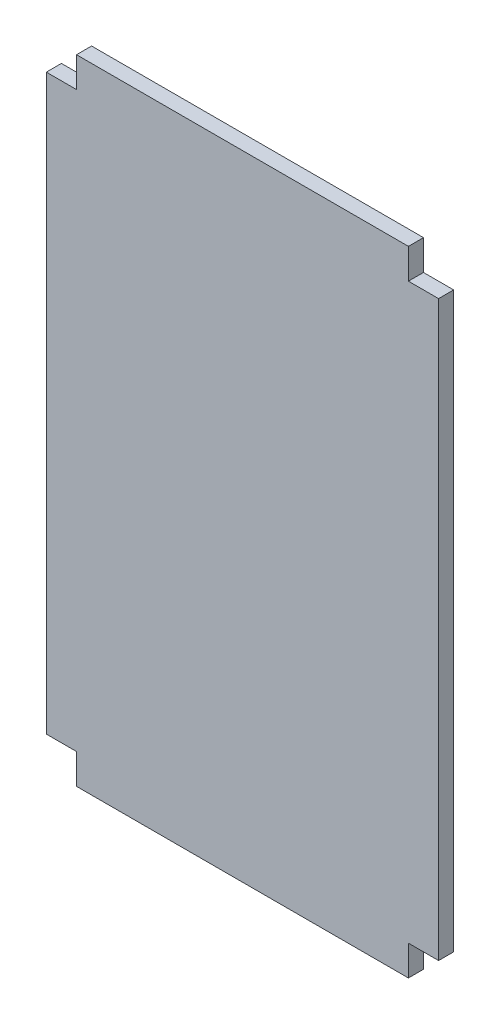
ISO-10303-21;
HEADER;
FILE_DESCRIPTION(('STEP AP214'),'2;1');
FILE_NAME('part.step','',(''),(''),'','','');
FILE_SCHEMA(('AUTOMOTIVE_DESIGN { 1 0 10303 214 1 1 1 1 }'));
ENDSEC;
DATA;
#1=APPLICATION_CONTEXT('core data for automotive mechanical design processes');
#2=APPLICATION_PROTOCOL_DEFINITION('international standard','automotive_design',2000,#1);
#3=PRODUCT_CONTEXT('',#1,'mechanical');
#4=PRODUCT('Part','Part','',(#3));
#5=PRODUCT_RELATED_PRODUCT_CATEGORY('part','',(#4));
#6=PRODUCT_DEFINITION_FORMATION('','',#4);
#7=PRODUCT_DEFINITION_CONTEXT('part definition',#1,'design');
#8=PRODUCT_DEFINITION('design','',#6,#7);
#9=PRODUCT_DEFINITION_SHAPE('','',#8);
#10=(LENGTH_UNIT() NAMED_UNIT(*) SI_UNIT(.MILLI.,.METRE.));
#11=(NAMED_UNIT(*) PLANE_ANGLE_UNIT() SI_UNIT($,.RADIAN.));
#12=(NAMED_UNIT(*) SI_UNIT($,.STERADIAN.) SOLID_ANGLE_UNIT());
#13=UNCERTAINTY_MEASURE_WITH_UNIT(LENGTH_MEASURE(1.E-05),#10,'distance_accuracy_value','');
#14=(GEOMETRIC_REPRESENTATION_CONTEXT(3) GLOBAL_UNCERTAINTY_ASSIGNED_CONTEXT((#13)) GLOBAL_UNIT_ASSIGNED_CONTEXT((#10,
#11,#12)) REPRESENTATION_CONTEXT('',''));
#15=CARTESIAN_POINT('',(0.,0.,0.));
#16=DIRECTION('',(0.,0.,1.));
#17=DIRECTION('',(1.,0.,0.));
#18=AXIS2_PLACEMENT_3D('',#15,#16,#17);
#19=CARTESIAN_POINT('',(0.,0.,20.));
#20=DIRECTION('',(1.,0.,0.));
#21=DIRECTION('',(0.,0.,-1.));
#22=AXIS2_PLACEMENT_3D('',#19,#20,#21);
#23=PLANE('',#22);
#24=DIRECTION('',(0.,-1.,0.));
#25=VECTOR('',#24,1.);
#26=CARTESIAN_POINT('',(0.,0.,20.));
#27=LINE('',#26,#25);
#28=CARTESIAN_POINT('',(0.,800.,20.));
#29=VERTEX_POINT('',#28);
#30=CARTESIAN_POINT('',(0.,40.,20.));
#31=VERTEX_POINT('',#30);
#32=EDGE_CURVE('E167',#29,#31,#27,.T.);
#33=ORIENTED_EDGE('',*,*,#32,.F.);
#34=DIRECTION('',(0.,0.,-1.));
#35=VECTOR('',#34,1.);
#36=CARTESIAN_POINT('',(0.,800.,30.));
#37=LINE('',#36,#35);
#38=CARTESIAN_POINT('',(0.,800.,0.));
#39=VERTEX_POINT('',#38);
#40=EDGE_CURVE('E204',#29,#39,#37,.T.);
#41=ORIENTED_EDGE('',*,*,#40,.T.);
#42=DIRECTION('',(0.,-1.,0.));
#43=VECTOR('',#42,1.);
#44=CARTESIAN_POINT('',(0.,0.,0.));
#45=LINE('',#44,#43);
#46=CARTESIAN_POINT('',(0.,40.,0.));
#47=VERTEX_POINT('',#46);
#48=EDGE_CURVE('E157',#39,#47,#45,.T.);
#49=ORIENTED_EDGE('',*,*,#48,.T.);
#50=DIRECTION('',(0.,0.,-1.));
#51=VECTOR('',#50,1.);
#52=CARTESIAN_POINT('',(0.,40.,30.));
#53=LINE('',#52,#51);
#54=EDGE_CURVE('E142',#31,#47,#53,.T.);
#55=ORIENTED_EDGE('',*,*,#54,.F.);
#56=EDGE_LOOP('',(#33,#41,#49,#55));
#57=FACE_BOUND('',#56,.T.);
#58=ADVANCED_FACE('F39',(#57),#23,.F.);
#59=CARTESIAN_POINT('',(0.,0.,20.));
#60=DIRECTION('',(0.,1.,0.));
#61=DIRECTION('',(0.,0.,1.));
#62=AXIS2_PLACEMENT_3D('',#59,#60,#61);
#63=PLANE('',#62);
#64=DIRECTION('',(1.,0.,0.));
#65=VECTOR('',#64,1.);
#66=CARTESIAN_POINT('',(0.,0.,0.));
#67=LINE('',#66,#65);
#68=CARTESIAN_POINT('',(40.,0.,0.));
#69=VERTEX_POINT('',#68);
#70=CARTESIAN_POINT('',(480.,0.,0.));
#71=VERTEX_POINT('',#70);
#72=EDGE_CURVE('E148',#69,#71,#67,.T.);
#73=ORIENTED_EDGE('',*,*,#72,.T.);
#74=DIRECTION('',(0.,0.,-1.));
#75=VECTOR('',#74,1.);
#76=CARTESIAN_POINT('',(480.,0.,30.));
#77=LINE('',#76,#75);
#78=CARTESIAN_POINT('',(480.,0.,20.));
#79=VERTEX_POINT('',#78);
#80=EDGE_CURVE('E55',#79,#71,#77,.T.);
#81=ORIENTED_EDGE('',*,*,#80,.F.);
#82=DIRECTION('',(1.,0.,0.));
#83=VECTOR('',#82,1.);
#84=CARTESIAN_POINT('',(0.,0.,20.));
#85=LINE('',#84,#83);
#86=CARTESIAN_POINT('',(40.,0.,20.));
#87=VERTEX_POINT('',#86);
#88=EDGE_CURVE('E150',#87,#79,#85,.T.);
#89=ORIENTED_EDGE('',*,*,#88,.F.);
#90=DIRECTION('',(0.,0.,-1.));
#91=VECTOR('',#90,1.);
#92=CARTESIAN_POINT('',(40.,0.,30.));
#93=LINE('',#92,#91);
#94=EDGE_CURVE('E133',#87,#69,#93,.T.);
#95=ORIENTED_EDGE('',*,*,#94,.T.);
#96=EDGE_LOOP('',(#73,#81,#89,#95));
#97=FACE_BOUND('',#96,.T.);
#98=ADVANCED_FACE('F147',(#97),#63,.F.);
#99=CARTESIAN_POINT('',(520.,0.,20.));
#100=DIRECTION('',(-1.,0.,0.));
#101=DIRECTION('',(0.,0.,1.));
#102=AXIS2_PLACEMENT_3D('',#99,#100,#101);
#103=PLANE('',#102);
#104=DIRECTION('',(0.,1.,0.));
#105=VECTOR('',#104,1.);
#106=CARTESIAN_POINT('',(520.,0.,20.));
#107=LINE('',#106,#105);
#108=CARTESIAN_POINT('',(520.,40.,20.));
#109=VERTEX_POINT('',#108);
#110=CARTESIAN_POINT('',(520.,800.,20.));
#111=VERTEX_POINT('',#110);
#112=EDGE_CURVE('E47',#109,#111,#107,.T.);
#113=ORIENTED_EDGE('',*,*,#112,.F.);
#114=DIRECTION('',(0.,0.,-1.));
#115=VECTOR('',#114,1.);
#116=CARTESIAN_POINT('',(520.,40.,30.));
#117=LINE('',#116,#115);
#118=CARTESIAN_POINT('',(520.,40.,0.));
#119=VERTEX_POINT('',#118);
#120=EDGE_CURVE('E207',#109,#119,#117,.T.);
#121=ORIENTED_EDGE('',*,*,#120,.T.);
#122=DIRECTION('',(0.,1.,0.));
#123=VECTOR('',#122,1.);
#124=CARTESIAN_POINT('',(520.,0.,0.));
#125=LINE('',#124,#123);
#126=CARTESIAN_POINT('',(520.,800.,0.));
#127=VERTEX_POINT('',#126);
#128=EDGE_CURVE('E156',#119,#127,#125,.T.);
#129=ORIENTED_EDGE('',*,*,#128,.T.);
#130=DIRECTION('',(0.,0.,-1.));
#131=VECTOR('',#130,1.);
#132=CARTESIAN_POINT('',(520.,800.,30.));
#133=LINE('',#132,#131);
#134=EDGE_CURVE('E63',#111,#127,#133,.T.);
#135=ORIENTED_EDGE('',*,*,#134,.F.);
#136=EDGE_LOOP('',(#113,#121,#129,#135));
#137=FACE_BOUND('',#136,.T.);
#138=ADVANCED_FACE('F264',(#137),#103,.F.);
#139=CARTESIAN_POINT('',(0.,840.,20.));
#140=DIRECTION('',(0.,-1.,0.));
#141=DIRECTION('',(0.,0.,-1.));
#142=AXIS2_PLACEMENT_3D('',#139,#140,#141);
#143=PLANE('',#142);
#144=DIRECTION('',(-1.,0.,0.));
#145=VECTOR('',#144,1.);
#146=CARTESIAN_POINT('',(0.,840.,0.));
#147=LINE('',#146,#145);
#148=CARTESIAN_POINT('',(480.,840.,0.));
#149=VERTEX_POINT('',#148);
#150=CARTESIAN_POINT('',(40.,840.,0.));
#151=VERTEX_POINT('',#150);
#152=EDGE_CURVE('E42',#149,#151,#147,.T.);
#153=ORIENTED_EDGE('',*,*,#152,.T.);
#154=DIRECTION('',(0.,0.,-1.));
#155=VECTOR('',#154,1.);
#156=CARTESIAN_POINT('',(40.,840.,30.));
#157=LINE('',#156,#155);
#158=CARTESIAN_POINT('',(40.,840.,20.));
#159=VERTEX_POINT('',#158);
#160=EDGE_CURVE('E217',#159,#151,#157,.T.);
#161=ORIENTED_EDGE('',*,*,#160,.F.);
#162=DIRECTION('',(-1.,0.,0.));
#163=VECTOR('',#162,1.);
#164=CARTESIAN_POINT('',(0.,840.,20.));
#165=LINE('',#164,#163);
#166=CARTESIAN_POINT('',(480.,840.,20.));
#167=VERTEX_POINT('',#166);
#168=EDGE_CURVE('E11',#167,#159,#165,.T.);
#169=ORIENTED_EDGE('',*,*,#168,.F.);
#170=DIRECTION('',(0.,0.,-1.));
#171=VECTOR('',#170,1.);
#172=CARTESIAN_POINT('',(480.,840.,30.));
#173=LINE('',#172,#171);
#174=EDGE_CURVE('E192',#167,#149,#173,.T.);
#175=ORIENTED_EDGE('',*,*,#174,.T.);
#176=EDGE_LOOP('',(#153,#161,#169,#175));
#177=FACE_BOUND('',#176,.T.);
#178=ADVANCED_FACE('F243',(#177),#143,.F.);
#179=CARTESIAN_POINT('',(0.,0.,20.));
#180=DIRECTION('',(0.,0.,-1.));
#181=DIRECTION('',(-1.,0.,0.));
#182=AXIS2_PLACEMENT_3D('',#179,#180,#181);
#183=PLANE('',#182);
#184=DIRECTION('',(0.,-1.,0.));
#185=VECTOR('',#184,1.);
#186=CARTESIAN_POINT('',(40.0000000000002,0.,20.));
#187=LINE('',#186,#185);
#188=CARTESIAN_POINT('',(40.,800.,20.));
#189=VERTEX_POINT('',#188);
#190=EDGE_CURVE('E172',#159,#189,#187,.T.);
#191=ORIENTED_EDGE('',*,*,#190,.T.);
#192=DIRECTION('',(-1.,0.,0.));
#193=VECTOR('',#192,1.);
#194=CARTESIAN_POINT('',(0.,800.,20.));
#195=LINE('',#194,#193);
#196=EDGE_CURVE('E161',#189,#29,#195,.T.);
#197=ORIENTED_EDGE('',*,*,#196,.T.);
#198=ORIENTED_EDGE('',*,*,#32,.T.);
#199=DIRECTION('',(1.,0.,0.));
#200=VECTOR('',#199,1.);
#201=CARTESIAN_POINT('',(0.,40.,20.));
#202=LINE('',#201,#200);
#203=CARTESIAN_POINT('',(40.,40.,20.));
#204=VERTEX_POINT('',#203);
#205=EDGE_CURVE('E183',#31,#204,#202,.T.);
#206=ORIENTED_EDGE('',*,*,#205,.T.);
#207=DIRECTION('',(0.,-1.,0.));
#208=VECTOR('',#207,1.);
#209=CARTESIAN_POINT('',(40.,0.,20.));
#210=LINE('',#209,#208);
#211=EDGE_CURVE('E181',#204,#87,#210,.T.);
#212=ORIENTED_EDGE('',*,*,#211,.T.);
#213=ORIENTED_EDGE('',*,*,#88,.T.);
#214=DIRECTION('',(0.,1.,0.));
#215=VECTOR('',#214,1.);
#216=CARTESIAN_POINT('',(480.,0.,20.));
#217=LINE('',#216,#215);
#218=CARTESIAN_POINT('',(480.,40.,20.));
#219=VERTEX_POINT('',#218);
#220=EDGE_CURVE('E178',#79,#219,#217,.T.);
#221=ORIENTED_EDGE('',*,*,#220,.T.);
#222=DIRECTION('',(1.,0.,0.));
#223=VECTOR('',#222,1.);
#224=CARTESIAN_POINT('',(0.,40.,20.));
#225=LINE('',#224,#223);
#226=EDGE_CURVE('E175',#219,#109,#225,.T.);
#227=ORIENTED_EDGE('',*,*,#226,.T.);
#228=ORIENTED_EDGE('',*,*,#112,.T.);
#229=DIRECTION('',(-1.,0.,0.));
#230=VECTOR('',#229,1.);
#231=CARTESIAN_POINT('',(-2.22044604925031E-12,799.999999999999,20.));
#232=LINE('',#231,#230);
#233=CARTESIAN_POINT('',(480.,800.,20.));
#234=VERTEX_POINT('',#233);
#235=EDGE_CURVE('E189',#111,#234,#232,.T.);
#236=ORIENTED_EDGE('',*,*,#235,.T.);
#237=DIRECTION('',(0.,1.,0.));
#238=VECTOR('',#237,1.);
#239=CARTESIAN_POINT('',(480.,0.,20.));
#240=LINE('',#239,#238);
#241=EDGE_CURVE('E186',#234,#167,#240,.T.);
#242=ORIENTED_EDGE('',*,*,#241,.T.);
#243=ORIENTED_EDGE('',*,*,#168,.T.);
#244=EDGE_LOOP('',(#191,#197,#198,#206,#212,#213,#221,#227,#228,#236,#242,#243));
#245=FACE_BOUND('',#244,.T.);
#246=ADVANCED_FACE('F235',(#245),#183,.F.);
#247=CARTESIAN_POINT('',(0.,0.,0.));
#248=DIRECTION('',(0.,0.,-1.));
#249=DIRECTION('',(-1.,0.,0.));
#250=AXIS2_PLACEMENT_3D('',#247,#248,#249);
#251=PLANE('',#250);
#252=DIRECTION('',(-1.,0.,0.));
#253=VECTOR('',#252,1.);
#254=CARTESIAN_POINT('',(0.,800.,0.));
#255=LINE('',#254,#253);
#256=CARTESIAN_POINT('',(40.,800.,0.));
#257=VERTEX_POINT('',#256);
#258=EDGE_CURVE('E215',#257,#39,#255,.T.);
#259=ORIENTED_EDGE('',*,*,#258,.F.);
#260=DIRECTION('',(0.,-1.,0.));
#261=VECTOR('',#260,1.);
#262=CARTESIAN_POINT('',(40.,840.,0.));
#263=LINE('',#262,#261);
#264=EDGE_CURVE('E202',#151,#257,#263,.T.);
#265=ORIENTED_EDGE('',*,*,#264,.F.);
#266=ORIENTED_EDGE('',*,*,#152,.F.);
#267=DIRECTION('',(0.,1.,0.));
#268=VECTOR('',#267,1.);
#269=CARTESIAN_POINT('',(480.,840.,0.));
#270=LINE('',#269,#268);
#271=CARTESIAN_POINT('',(480.,800.,0.));
#272=VERTEX_POINT('',#271);
#273=EDGE_CURVE('E195',#272,#149,#270,.T.);
#274=ORIENTED_EDGE('',*,*,#273,.F.);
#275=DIRECTION('',(-1.,0.,0.));
#276=VECTOR('',#275,1.);
#277=CARTESIAN_POINT('',(520.,800.,0.));
#278=LINE('',#277,#276);
#279=EDGE_CURVE('E200',#127,#272,#278,.T.);
#280=ORIENTED_EDGE('',*,*,#279,.F.);
#281=ORIENTED_EDGE('',*,*,#128,.F.);
#282=DIRECTION('',(1.,0.,0.));
#283=VECTOR('',#282,1.);
#284=CARTESIAN_POINT('',(520.,40.,0.));
#285=LINE('',#284,#283);
#286=CARTESIAN_POINT('',(480.,40.,0.));
#287=VERTEX_POINT('',#286);
#288=EDGE_CURVE('E205',#287,#119,#285,.T.);
#289=ORIENTED_EDGE('',*,*,#288,.F.);
#290=DIRECTION('',(0.,1.,0.));
#291=VECTOR('',#290,1.);
#292=CARTESIAN_POINT('',(480.,0.,0.));
#293=LINE('',#292,#291);
#294=EDGE_CURVE('E155',#71,#287,#293,.T.);
#295=ORIENTED_EDGE('',*,*,#294,.F.);
#296=ORIENTED_EDGE('',*,*,#72,.F.);
#297=DIRECTION('',(0.,-1.,0.));
#298=VECTOR('',#297,1.);
#299=CARTESIAN_POINT('',(40.,0.,0.));
#300=LINE('',#299,#298);
#301=CARTESIAN_POINT('',(40.,40.,0.));
#302=VERTEX_POINT('',#301);
#303=EDGE_CURVE('E130',#302,#69,#300,.T.);
#304=ORIENTED_EDGE('',*,*,#303,.F.);
#305=DIRECTION('',(1.,0.,0.));
#306=VECTOR('',#305,1.);
#307=CARTESIAN_POINT('',(0.,40.,0.));
#308=LINE('',#307,#306);
#309=EDGE_CURVE('E141',#47,#302,#308,.T.);
#310=ORIENTED_EDGE('',*,*,#309,.F.);
#311=ORIENTED_EDGE('',*,*,#48,.F.);
#312=EDGE_LOOP('',(#259,#265,#266,#274,#280,#281,#289,#295,#296,#304,#310,#311));
#313=FACE_BOUND('',#312,.T.);
#314=ADVANCED_FACE('F153',(#313),#251,.T.);
#315=CARTESIAN_POINT('',(480.,840.,30.));
#316=DIRECTION('',(-1.,0.,0.));
#317=DIRECTION('',(0.,0.,1.));
#318=AXIS2_PLACEMENT_3D('',#315,#316,#317);
#319=PLANE('',#318);
#320=DIRECTION('',(0.,0.,-1.));
#321=VECTOR('',#320,1.);
#322=CARTESIAN_POINT('',(480.,800.,30.));
#323=LINE('',#322,#321);
#324=EDGE_CURVE('E194',#234,#272,#323,.T.);
#325=ORIENTED_EDGE('',*,*,#324,.T.);
#326=ORIENTED_EDGE('',*,*,#273,.T.);
#327=ORIENTED_EDGE('',*,*,#174,.F.);
#328=ORIENTED_EDGE('',*,*,#241,.F.);
#329=EDGE_LOOP('',(#325,#326,#327,#328));
#330=FACE_BOUND('',#329,.T.);
#331=ADVANCED_FACE('F248',(#330),#319,.F.);
#332=CARTESIAN_POINT('',(520.,800.,30.));
#333=DIRECTION('',(0.,-1.,0.));
#334=DIRECTION('',(1.,0.,0.));
#335=AXIS2_PLACEMENT_3D('',#332,#333,#334);
#336=PLANE('',#335);
#337=ORIENTED_EDGE('',*,*,#134,.T.);
#338=ORIENTED_EDGE('',*,*,#279,.T.);
#339=ORIENTED_EDGE('',*,*,#324,.F.);
#340=ORIENTED_EDGE('',*,*,#235,.F.);
#341=EDGE_LOOP('',(#337,#338,#339,#340));
#342=FACE_BOUND('',#341,.T.);
#343=ADVANCED_FACE('F250',(#342),#336,.F.);
#344=CARTESIAN_POINT('',(40.,0.,30.));
#345=DIRECTION('',(1.,0.,0.));
#346=DIRECTION('',(0.,0.,-1.));
#347=AXIS2_PLACEMENT_3D('',#344,#345,#346);
#348=PLANE('',#347);
#349=DIRECTION('',(0.,0.,-1.));
#350=VECTOR('',#349,1.);
#351=CARTESIAN_POINT('',(40.,40.,30.));
#352=LINE('',#351,#350);
#353=EDGE_CURVE('E136',#204,#302,#352,.T.);
#354=ORIENTED_EDGE('',*,*,#353,.T.);
#355=ORIENTED_EDGE('',*,*,#303,.T.);
#356=ORIENTED_EDGE('',*,*,#94,.F.);
#357=ORIENTED_EDGE('',*,*,#211,.F.);
#358=EDGE_LOOP('',(#354,#355,#356,#357));
#359=FACE_BOUND('',#358,.T.);
#360=ADVANCED_FACE('F132',(#359),#348,.F.);
#361=CARTESIAN_POINT('',(0.,40.,30.));
#362=DIRECTION('',(0.,1.,0.));
#363=DIRECTION('',(0.,0.,1.));
#364=AXIS2_PLACEMENT_3D('',#361,#362,#363);
#365=PLANE('',#364);
#366=ORIENTED_EDGE('',*,*,#54,.T.);
#367=ORIENTED_EDGE('',*,*,#309,.T.);
#368=ORIENTED_EDGE('',*,*,#353,.F.);
#369=ORIENTED_EDGE('',*,*,#205,.F.);
#370=EDGE_LOOP('',(#366,#367,#368,#369));
#371=FACE_BOUND('',#370,.T.);
#372=ADVANCED_FACE('F227',(#371),#365,.F.);
#373=CARTESIAN_POINT('',(520.,40.,30.));
#374=DIRECTION('',(0.,1.,0.));
#375=DIRECTION('',(0.,0.,1.));
#376=AXIS2_PLACEMENT_3D('',#373,#374,#375);
#377=PLANE('',#376);
#378=DIRECTION('',(0.,0.,-1.));
#379=VECTOR('',#378,1.);
#380=CARTESIAN_POINT('',(480.,40.,30.));
#381=LINE('',#380,#379);
#382=EDGE_CURVE('E210',#219,#287,#381,.T.);
#383=ORIENTED_EDGE('',*,*,#382,.T.);
#384=ORIENTED_EDGE('',*,*,#288,.T.);
#385=ORIENTED_EDGE('',*,*,#120,.F.);
#386=ORIENTED_EDGE('',*,*,#226,.F.);
#387=EDGE_LOOP('',(#383,#384,#385,#386));
#388=FACE_BOUND('',#387,.T.);
#389=ADVANCED_FACE('F309',(#388),#377,.F.);
#390=CARTESIAN_POINT('',(480.,0.,30.));
#391=DIRECTION('',(-1.,0.,0.));
#392=DIRECTION('',(0.,0.,1.));
#393=AXIS2_PLACEMENT_3D('',#390,#391,#392);
#394=PLANE('',#393);
#395=ORIENTED_EDGE('',*,*,#80,.T.);
#396=ORIENTED_EDGE('',*,*,#294,.T.);
#397=ORIENTED_EDGE('',*,*,#382,.F.);
#398=ORIENTED_EDGE('',*,*,#220,.F.);
#399=EDGE_LOOP('',(#395,#396,#397,#398));
#400=FACE_BOUND('',#399,.T.);
#401=ADVANCED_FACE('F318',(#400),#394,.F.);
#402=CARTESIAN_POINT('',(0.,800.,30.));
#403=DIRECTION('',(0.,-1.,0.));
#404=DIRECTION('',(0.,0.,-1.));
#405=AXIS2_PLACEMENT_3D('',#402,#403,#404);
#406=PLANE('',#405);
#407=DIRECTION('',(0.,0.,-1.));
#408=VECTOR('',#407,1.);
#409=CARTESIAN_POINT('',(40.,800.,30.));
#410=LINE('',#409,#408);
#411=EDGE_CURVE('E220',#189,#257,#410,.T.);
#412=ORIENTED_EDGE('',*,*,#411,.T.);
#413=ORIENTED_EDGE('',*,*,#258,.T.);
#414=ORIENTED_EDGE('',*,*,#40,.F.);
#415=ORIENTED_EDGE('',*,*,#196,.F.);
#416=EDGE_LOOP('',(#412,#413,#414,#415));
#417=FACE_BOUND('',#416,.T.);
#418=ADVANCED_FACE('F232',(#417),#406,.F.);
#419=CARTESIAN_POINT('',(40.,840.,30.));
#420=DIRECTION('',(1.,0.,0.));
#421=DIRECTION('',(0.,1.,0.));
#422=AXIS2_PLACEMENT_3D('',#419,#420,#421);
#423=PLANE('',#422);
#424=ORIENTED_EDGE('',*,*,#160,.T.);
#425=ORIENTED_EDGE('',*,*,#264,.T.);
#426=ORIENTED_EDGE('',*,*,#411,.F.);
#427=ORIENTED_EDGE('',*,*,#190,.F.);
#428=EDGE_LOOP('',(#424,#425,#426,#427));
#429=FACE_BOUND('',#428,.T.);
#430=ADVANCED_FACE('F239',(#429),#423,.F.);
#431=CLOSED_SHELL('',(#58,#98,#138,#178,#246,#314,#331,#343,#360,#372,#389,#401,#418,#430));
#432=MANIFOLD_SOLID_BREP('B2',#431);
#433=ADVANCED_BREP_SHAPE_REPRESENTATION('',(#18,#432),#14);
#434=SHAPE_DEFINITION_REPRESENTATION(#9,#433);
ENDSEC;
END-ISO-10303-21;
